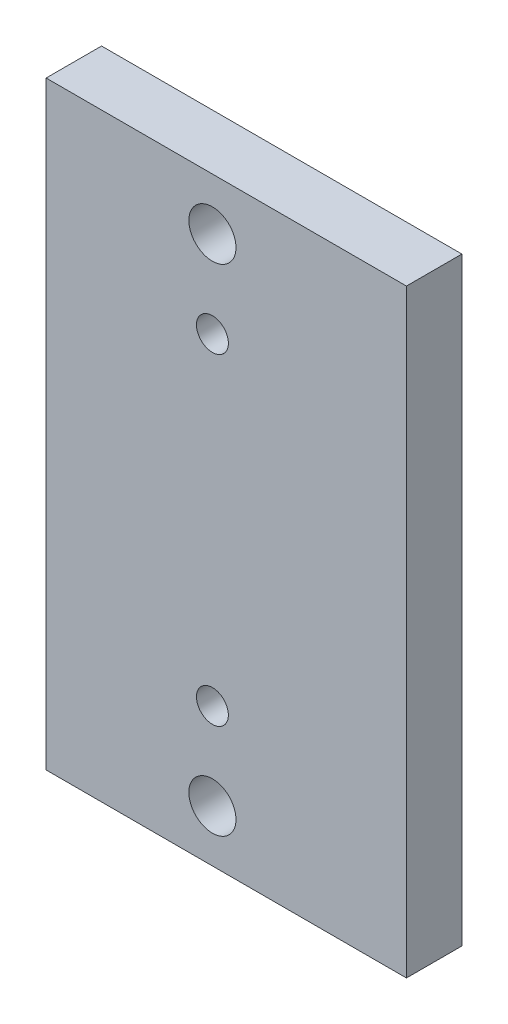
ISO-10303-21;
HEADER;
FILE_DESCRIPTION(('STEP AP214'),'2;1');
FILE_NAME('part.step','',(''),(''),'','','');
FILE_SCHEMA(('AUTOMOTIVE_DESIGN { 1 0 10303 214 1 1 1 1 }'));
ENDSEC;
DATA;
#1=APPLICATION_CONTEXT('core data for automotive mechanical design processes');
#2=APPLICATION_PROTOCOL_DEFINITION('international standard','automotive_design',2000,#1);
#3=PRODUCT_CONTEXT('',#1,'mechanical');
#4=PRODUCT('Part','Part','',(#3));
#5=PRODUCT_RELATED_PRODUCT_CATEGORY('part','',(#4));
#6=PRODUCT_DEFINITION_FORMATION('','',#4);
#7=PRODUCT_DEFINITION_CONTEXT('part definition',#1,'design');
#8=PRODUCT_DEFINITION('design','',#6,#7);
#9=PRODUCT_DEFINITION_SHAPE('','',#8);
#10=(LENGTH_UNIT() NAMED_UNIT(*) SI_UNIT(.MILLI.,.METRE.));
#11=(NAMED_UNIT(*) PLANE_ANGLE_UNIT() SI_UNIT($,.RADIAN.));
#12=(NAMED_UNIT(*) SI_UNIT($,.STERADIAN.) SOLID_ANGLE_UNIT());
#13=UNCERTAINTY_MEASURE_WITH_UNIT(LENGTH_MEASURE(1.E-05),#10,'distance_accuracy_value','');
#14=(GEOMETRIC_REPRESENTATION_CONTEXT(3) GLOBAL_UNCERTAINTY_ASSIGNED_CONTEXT((#13)) GLOBAL_UNIT_ASSIGNED_CONTEXT((#10,
#11,#12)) REPRESENTATION_CONTEXT('',''));
#15=CARTESIAN_POINT('',(0.,0.,0.));
#16=DIRECTION('',(0.,0.,1.));
#17=DIRECTION('',(1.,0.,0.));
#18=AXIS2_PLACEMENT_3D('',#15,#16,#17);
#19=CARTESIAN_POINT('',(0.,0.,4.));
#20=DIRECTION('',(0.,0.,1.));
#21=DIRECTION('',(1.,0.,0.));
#22=AXIS2_PLACEMENT_3D('',#19,#20,#21);
#23=PLANE('',#22);
#24=CARTESIAN_POINT('',(8.,-6.62,4.));
#25=DIRECTION('',(0.,0.,1.));
#26=DIRECTION('',(1.,0.,0.));
#27=AXIS2_PLACEMENT_3D('',#24,#25,#26);
#28=CIRCLE('',#27,1.15);
#29=CARTESIAN_POINT('',(9.15,-6.62,4.));
#30=VERTEX_POINT('',#29);
#31=EDGE_CURVE('E123',#30,#30,#28,.T.);
#32=ORIENTED_EDGE('',*,*,#31,.F.);
#33=EDGE_LOOP('',(#32));
#34=FACE_BOUND('',#33,.T.);
#35=CARTESIAN_POINT('',(8.,-12.87,4.));
#36=DIRECTION('',(0.,0.,1.));
#37=DIRECTION('',(1.,0.,0.));
#38=AXIS2_PLACEMENT_3D('',#35,#36,#37);
#39=CIRCLE('',#38,1.7);
#40=CARTESIAN_POINT('',(9.7,-12.87,4.));
#41=VERTEX_POINT('',#40);
#42=EDGE_CURVE('E102',#41,#41,#39,.T.);
#43=ORIENTED_EDGE('',*,*,#42,.F.);
#44=EDGE_LOOP('',(#43));
#45=FACE_BOUND('',#44,.T.);
#46=DIRECTION('',(0.,-1.,0.));
#47=VECTOR('',#46,1.);
#48=CARTESIAN_POINT('',(-4.,26.62,4.));
#49=LINE('',#48,#47);
#50=CARTESIAN_POINT('',(-4.,26.62,4.));
#51=VERTEX_POINT('',#50);
#52=CARTESIAN_POINT('',(-4.,-16.62,4.));
#53=VERTEX_POINT('',#52);
#54=EDGE_CURVE('E87',#51,#53,#49,.T.);
#55=ORIENTED_EDGE('',*,*,#54,.T.);
#56=DIRECTION('',(1.,0.,0.));
#57=VECTOR('',#56,1.);
#58=CARTESIAN_POINT('',(-4.,-16.62,4.));
#59=LINE('',#58,#57);
#60=CARTESIAN_POINT('',(22.,-16.62,4.));
#61=VERTEX_POINT('',#60);
#62=EDGE_CURVE('E82',#53,#61,#59,.T.);
#63=ORIENTED_EDGE('',*,*,#62,.T.);
#64=DIRECTION('',(0.,1.,0.));
#65=VECTOR('',#64,1.);
#66=CARTESIAN_POINT('',(22.,-16.62,4.));
#67=LINE('',#66,#65);
#68=CARTESIAN_POINT('',(22.,26.62,4.));
#69=VERTEX_POINT('',#68);
#70=EDGE_CURVE('E85',#61,#69,#67,.T.);
#71=ORIENTED_EDGE('',*,*,#70,.T.);
#72=DIRECTION('',(-1.,0.,0.));
#73=VECTOR('',#72,1.);
#74=CARTESIAN_POINT('',(22.,26.62,4.));
#75=LINE('',#74,#73);
#76=EDGE_CURVE('E52',#69,#51,#75,.T.);
#77=ORIENTED_EDGE('',*,*,#76,.T.);
#78=EDGE_LOOP('',(#55,#63,#71,#77));
#79=FACE_BOUND('',#78,.T.);
#80=CARTESIAN_POINT('',(8.,22.87,4.));
#81=DIRECTION('',(0.,0.,1.));
#82=DIRECTION('',(1.,0.,0.));
#83=AXIS2_PLACEMENT_3D('',#80,#81,#82);
#84=CIRCLE('',#83,1.7);
#85=CARTESIAN_POINT('',(9.7,22.87,4.));
#86=VERTEX_POINT('',#85);
#87=EDGE_CURVE('E117',#86,#86,#84,.T.);
#88=ORIENTED_EDGE('',*,*,#87,.F.);
#89=EDGE_LOOP('',(#88));
#90=FACE_BOUND('',#89,.T.);
#91=CARTESIAN_POINT('',(8.,16.62,4.));
#92=DIRECTION('',(0.,0.,1.));
#93=DIRECTION('',(1.,0.,0.));
#94=AXIS2_PLACEMENT_3D('',#91,#92,#93);
#95=CIRCLE('',#94,1.15);
#96=CARTESIAN_POINT('',(9.15,16.62,4.));
#97=VERTEX_POINT('',#96);
#98=EDGE_CURVE('E129',#97,#97,#95,.T.);
#99=ORIENTED_EDGE('',*,*,#98,.F.);
#100=EDGE_LOOP('',(#99));
#101=FACE_BOUND('',#100,.T.);
#102=ADVANCED_FACE('F35',(#34,#45,#79,#90,#101),#23,.T.);
#103=CARTESIAN_POINT('',(0.,0.,0.));
#104=DIRECTION('',(0.,0.,1.));
#105=DIRECTION('',(1.,0.,0.));
#106=AXIS2_PLACEMENT_3D('',#103,#104,#105);
#107=PLANE('',#106);
#108=DIRECTION('',(0.,-1.,0.));
#109=VECTOR('',#108,1.);
#110=CARTESIAN_POINT('',(-4.,26.62,0.));
#111=LINE('',#110,#109);
#112=CARTESIAN_POINT('',(-4.,26.62,0.));
#113=VERTEX_POINT('',#112);
#114=CARTESIAN_POINT('',(-4.,-16.62,0.));
#115=VERTEX_POINT('',#114);
#116=EDGE_CURVE('E99',#113,#115,#111,.T.);
#117=ORIENTED_EDGE('',*,*,#116,.F.);
#118=DIRECTION('',(-1.,0.,0.));
#119=VECTOR('',#118,1.);
#120=CARTESIAN_POINT('',(22.,26.62,0.));
#121=LINE('',#120,#119);
#122=CARTESIAN_POINT('',(22.,26.62,0.));
#123=VERTEX_POINT('',#122);
#124=EDGE_CURVE('E75',#123,#113,#121,.T.);
#125=ORIENTED_EDGE('',*,*,#124,.F.);
#126=DIRECTION('',(0.,1.,0.));
#127=VECTOR('',#126,1.);
#128=CARTESIAN_POINT('',(22.,-16.62,0.));
#129=LINE('',#128,#127);
#130=CARTESIAN_POINT('',(22.,-16.62,0.));
#131=VERTEX_POINT('',#130);
#132=EDGE_CURVE('E69',#131,#123,#129,.T.);
#133=ORIENTED_EDGE('',*,*,#132,.F.);
#134=DIRECTION('',(1.,0.,0.));
#135=VECTOR('',#134,1.);
#136=CARTESIAN_POINT('',(-4.,-16.62,0.));
#137=LINE('',#136,#135);
#138=EDGE_CURVE('E91',#115,#131,#137,.T.);
#139=ORIENTED_EDGE('',*,*,#138,.F.);
#140=EDGE_LOOP('',(#117,#125,#133,#139));
#141=FACE_BOUND('',#140,.T.);
#142=CARTESIAN_POINT('',(8.,-12.87,0.));
#143=DIRECTION('',(0.,0.,1.));
#144=DIRECTION('',(1.,0.,0.));
#145=AXIS2_PLACEMENT_3D('',#142,#143,#144);
#146=CIRCLE('',#145,1.7);
#147=CARTESIAN_POINT('',(9.7,-12.87,0.));
#148=VERTEX_POINT('',#147);
#149=EDGE_CURVE('E114',#148,#148,#146,.T.);
#150=ORIENTED_EDGE('',*,*,#149,.T.);
#151=EDGE_LOOP('',(#150));
#152=FACE_BOUND('',#151,.T.);
#153=CARTESIAN_POINT('',(8.,22.87,0.));
#154=DIRECTION('',(0.,0.,1.));
#155=DIRECTION('',(1.,0.,0.));
#156=AXIS2_PLACEMENT_3D('',#153,#154,#155);
#157=CIRCLE('',#156,1.7);
#158=CARTESIAN_POINT('',(9.7,22.87,0.));
#159=VERTEX_POINT('',#158);
#160=EDGE_CURVE('E120',#159,#159,#157,.T.);
#161=ORIENTED_EDGE('',*,*,#160,.T.);
#162=EDGE_LOOP('',(#161));
#163=FACE_BOUND('',#162,.T.);
#164=CARTESIAN_POINT('',(8.,-6.62,0.));
#165=DIRECTION('',(0.,0.,1.));
#166=DIRECTION('',(1.,0.,0.));
#167=AXIS2_PLACEMENT_3D('',#164,#165,#166);
#168=CIRCLE('',#167,1.15);
#169=CARTESIAN_POINT('',(9.15,-6.62,0.));
#170=VERTEX_POINT('',#169);
#171=EDGE_CURVE('E126',#170,#170,#168,.T.);
#172=ORIENTED_EDGE('',*,*,#171,.T.);
#173=EDGE_LOOP('',(#172));
#174=FACE_BOUND('',#173,.T.);
#175=CARTESIAN_POINT('',(8.,16.62,0.));
#176=DIRECTION('',(0.,0.,1.));
#177=DIRECTION('',(1.,0.,0.));
#178=AXIS2_PLACEMENT_3D('',#175,#176,#177);
#179=CIRCLE('',#178,1.15);
#180=CARTESIAN_POINT('',(9.15,16.62,0.));
#181=VERTEX_POINT('',#180);
#182=EDGE_CURVE('E132',#181,#181,#179,.T.);
#183=ORIENTED_EDGE('',*,*,#182,.T.);
#184=EDGE_LOOP('',(#183));
#185=FACE_BOUND('',#184,.T.);
#186=ADVANCED_FACE('F110',(#141,#152,#163,#174,#185),#107,.F.);
#187=CARTESIAN_POINT('',(-4.,26.62,4.));
#188=DIRECTION('',(1.,0.,0.));
#189=DIRECTION('',(0.,0.,-1.));
#190=AXIS2_PLACEMENT_3D('',#187,#188,#189);
#191=PLANE('',#190);
#192=ORIENTED_EDGE('',*,*,#116,.T.);
#193=DIRECTION('',(0.,0.,-1.));
#194=VECTOR('',#193,1.);
#195=CARTESIAN_POINT('',(-4.,-16.62,4.));
#196=LINE('',#195,#194);
#197=EDGE_CURVE('E11',#53,#115,#196,.T.);
#198=ORIENTED_EDGE('',*,*,#197,.F.);
#199=ORIENTED_EDGE('',*,*,#54,.F.);
#200=DIRECTION('',(0.,0.,-1.));
#201=VECTOR('',#200,1.);
#202=CARTESIAN_POINT('',(-4.,26.62,4.));
#203=LINE('',#202,#201);
#204=EDGE_CURVE('E95',#51,#113,#203,.T.);
#205=ORIENTED_EDGE('',*,*,#204,.T.);
#206=EDGE_LOOP('',(#192,#198,#199,#205));
#207=FACE_BOUND('',#206,.T.);
#208=ADVANCED_FACE('F37',(#207),#191,.F.);
#209=CARTESIAN_POINT('',(-4.,-16.62,4.));
#210=DIRECTION('',(0.,1.,0.));
#211=DIRECTION('',(0.,0.,1.));
#212=AXIS2_PLACEMENT_3D('',#209,#210,#211);
#213=PLANE('',#212);
#214=ORIENTED_EDGE('',*,*,#138,.T.);
#215=DIRECTION('',(0.,0.,-1.));
#216=VECTOR('',#215,1.);
#217=CARTESIAN_POINT('',(22.,-16.62,4.));
#218=LINE('',#217,#216);
#219=EDGE_CURVE('E44',#61,#131,#218,.T.);
#220=ORIENTED_EDGE('',*,*,#219,.F.);
#221=ORIENTED_EDGE('',*,*,#62,.F.);
#222=ORIENTED_EDGE('',*,*,#197,.T.);
#223=EDGE_LOOP('',(#214,#220,#221,#222));
#224=FACE_BOUND('',#223,.T.);
#225=ADVANCED_FACE('F90',(#224),#213,.F.);
#226=CARTESIAN_POINT('',(22.,-16.62,4.));
#227=DIRECTION('',(-1.,0.,0.));
#228=DIRECTION('',(0.,0.,1.));
#229=AXIS2_PLACEMENT_3D('',#226,#227,#228);
#230=PLANE('',#229);
#231=ORIENTED_EDGE('',*,*,#132,.T.);
#232=DIRECTION('',(0.,0.,-1.));
#233=VECTOR('',#232,1.);
#234=CARTESIAN_POINT('',(22.,26.62,4.));
#235=LINE('',#234,#233);
#236=EDGE_CURVE('E92',#69,#123,#235,.T.);
#237=ORIENTED_EDGE('',*,*,#236,.F.);
#238=ORIENTED_EDGE('',*,*,#70,.F.);
#239=ORIENTED_EDGE('',*,*,#219,.T.);
#240=EDGE_LOOP('',(#231,#237,#238,#239));
#241=FACE_BOUND('',#240,.T.);
#242=ADVANCED_FACE('F93',(#241),#230,.F.);
#243=CARTESIAN_POINT('',(22.,26.62,4.));
#244=DIRECTION('',(0.,-1.,0.));
#245=DIRECTION('',(0.,0.,-1.));
#246=AXIS2_PLACEMENT_3D('',#243,#244,#245);
#247=PLANE('',#246);
#248=ORIENTED_EDGE('',*,*,#124,.T.);
#249=ORIENTED_EDGE('',*,*,#204,.F.);
#250=ORIENTED_EDGE('',*,*,#76,.F.);
#251=ORIENTED_EDGE('',*,*,#236,.T.);
#252=EDGE_LOOP('',(#248,#249,#250,#251));
#253=FACE_BOUND('',#252,.T.);
#254=ADVANCED_FACE('F107',(#253),#247,.F.);
#255=CARTESIAN_POINT('',(8.,-12.87,4.));
#256=DIRECTION('',(0.,0.,-1.));
#257=DIRECTION('',(-1.,0.,0.));
#258=AXIS2_PLACEMENT_3D('',#255,#256,#257);
#259=CYLINDRICAL_SURFACE('',#258,1.7);
#260=ORIENTED_EDGE('',*,*,#42,.T.);
#261=EDGE_LOOP('',(#260));
#262=FACE_BOUND('',#261,.T.);
#263=ORIENTED_EDGE('',*,*,#149,.F.);
#264=EDGE_LOOP('',(#263));
#265=FACE_BOUND('',#264,.T.);
#266=ADVANCED_FACE('F151',(#262,#265),#259,.F.);
#267=CARTESIAN_POINT('',(8.,22.87,4.));
#268=DIRECTION('',(0.,0.,-1.));
#269=DIRECTION('',(-1.,0.,0.));
#270=AXIS2_PLACEMENT_3D('',#267,#268,#269);
#271=CYLINDRICAL_SURFACE('',#270,1.7);
#272=ORIENTED_EDGE('',*,*,#87,.T.);
#273=EDGE_LOOP('',(#272));
#274=FACE_BOUND('',#273,.T.);
#275=ORIENTED_EDGE('',*,*,#160,.F.);
#276=EDGE_LOOP('',(#275));
#277=FACE_BOUND('',#276,.T.);
#278=ADVANCED_FACE('F197',(#274,#277),#271,.F.);
#279=CARTESIAN_POINT('',(8.,-6.62,4.));
#280=DIRECTION('',(0.,0.,-1.));
#281=DIRECTION('',(-1.,0.,0.));
#282=AXIS2_PLACEMENT_3D('',#279,#280,#281);
#283=CYLINDRICAL_SURFACE('',#282,1.15);
#284=ORIENTED_EDGE('',*,*,#31,.T.);
#285=EDGE_LOOP('',(#284));
#286=FACE_BOUND('',#285,.T.);
#287=ORIENTED_EDGE('',*,*,#171,.F.);
#288=EDGE_LOOP('',(#287));
#289=FACE_BOUND('',#288,.T.);
#290=ADVANCED_FACE('F205',(#286,#289),#283,.F.);
#291=CARTESIAN_POINT('',(8.,16.62,4.));
#292=DIRECTION('',(0.,0.,-1.));
#293=DIRECTION('',(-1.,0.,0.));
#294=AXIS2_PLACEMENT_3D('',#291,#292,#293);
#295=CYLINDRICAL_SURFACE('',#294,1.15);
#296=ORIENTED_EDGE('',*,*,#98,.T.);
#297=EDGE_LOOP('',(#296));
#298=FACE_BOUND('',#297,.T.);
#299=ORIENTED_EDGE('',*,*,#182,.F.);
#300=EDGE_LOOP('',(#299));
#301=FACE_BOUND('',#300,.T.);
#302=ADVANCED_FACE('F138',(#298,#301),#295,.F.);
#303=CLOSED_SHELL('',(#102,#186,#208,#225,#242,#254,#266,#278,#290,#302));
#304=MANIFOLD_SOLID_BREP('B2',#303);
#305=ADVANCED_BREP_SHAPE_REPRESENTATION('',(#18,#304),#14);
#306=SHAPE_DEFINITION_REPRESENTATION(#9,#305);
ENDSEC;
END-ISO-10303-21;
